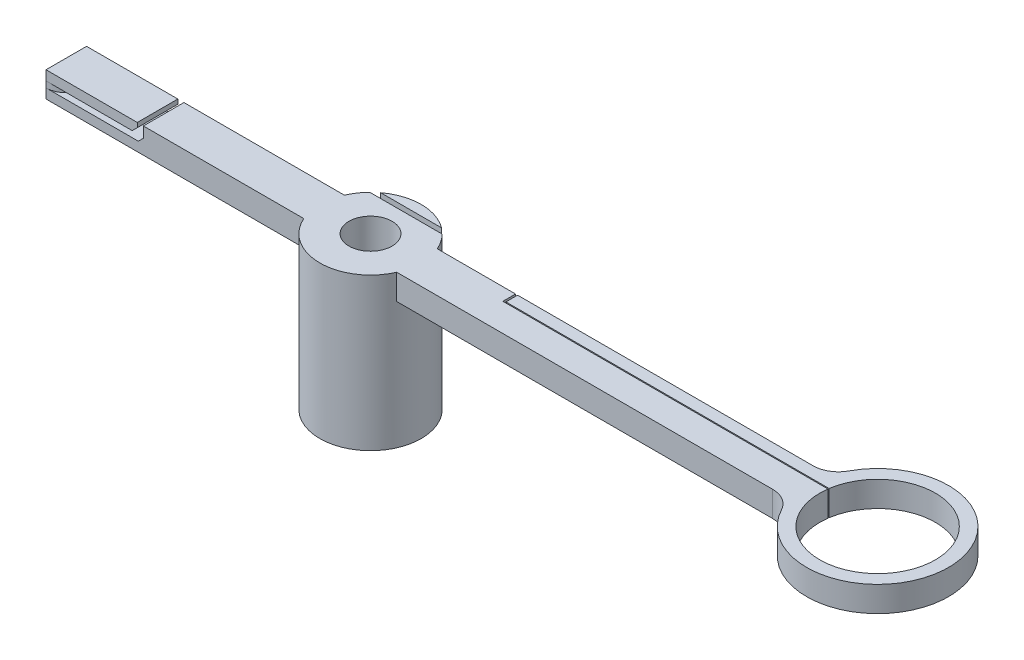
ISO-10303-21;
HEADER;
FILE_DESCRIPTION(('STEP AP214'),'2;1');
FILE_NAME('part.step','',(''),(''),'','','');
FILE_SCHEMA(('AUTOMOTIVE_DESIGN { 1 0 10303 214 1 1 1 1 }'));
ENDSEC;
DATA;
#1=APPLICATION_CONTEXT('core data for automotive mechanical design processes');
#2=APPLICATION_PROTOCOL_DEFINITION('international standard','automotive_design',2000,#1);
#3=PRODUCT_CONTEXT('',#1,'mechanical');
#4=PRODUCT('Part','Part','',(#3));
#5=PRODUCT_RELATED_PRODUCT_CATEGORY('part','',(#4));
#6=PRODUCT_DEFINITION_FORMATION('','',#4);
#7=PRODUCT_DEFINITION_CONTEXT('part definition',#1,'design');
#8=PRODUCT_DEFINITION('design','',#6,#7);
#9=PRODUCT_DEFINITION_SHAPE('','',#8);
#10=(LENGTH_UNIT() NAMED_UNIT(*) SI_UNIT(.MILLI.,.METRE.));
#11=(NAMED_UNIT(*) PLANE_ANGLE_UNIT() SI_UNIT($,.RADIAN.));
#12=(NAMED_UNIT(*) SI_UNIT($,.STERADIAN.) SOLID_ANGLE_UNIT());
#13=UNCERTAINTY_MEASURE_WITH_UNIT(LENGTH_MEASURE(1.E-05),#10,'distance_accuracy_value','');
#14=(GEOMETRIC_REPRESENTATION_CONTEXT(3) GLOBAL_UNCERTAINTY_ASSIGNED_CONTEXT((#13)) GLOBAL_UNIT_ASSIGNED_CONTEXT((#10,
#11,#12)) REPRESENTATION_CONTEXT('',''));
#15=CARTESIAN_POINT('',(0.,0.,0.));
#16=DIRECTION('',(0.,0.,1.));
#17=DIRECTION('',(1.,0.,0.));
#18=AXIS2_PLACEMENT_3D('',#15,#16,#17);
#19=CARTESIAN_POINT('',(0.,5.,0.));
#20=DIRECTION('',(0.,1.,0.));
#21=DIRECTION('',(0.,0.,1.));
#22=AXIS2_PLACEMENT_3D('',#19,#20,#21);
#23=PLANE('',#22);
#24=DIRECTION('',(-1.,0.,0.));
#25=VECTOR('',#24,1.);
#26=CARTESIAN_POINT('',(-107.141428428543,5.,-8.));
#27=LINE('',#26,#25);
#28=CARTESIAN_POINT('',(-94.,5.,-8.));
#29=VERTEX_POINT('',#28);
#30=CARTESIAN_POINT('',(-106.,5.,-8.));
#31=VERTEX_POINT('',#30);
#32=EDGE_CURVE('E261',#29,#31,#27,.T.);
#33=ORIENTED_EDGE('',*,*,#32,.F.);
#34=CARTESIAN_POINT('',(-100.,5.,0.));
#35=DIRECTION('',(0.,1.,0.));
#36=DIRECTION('',(0.,0.,1.));
#37=AXIS2_PLACEMENT_3D('',#34,#35,#36);
#38=CIRCLE('',#37,9.99999999999999);
#39=EDGE_CURVE('E490',#29,#31,#38,.T.);
#40=ORIENTED_EDGE('',*,*,#39,.T.);
#41=EDGE_LOOP('',(#33,#40));
#42=FACE_BOUND('',#41,.T.);
#43=ADVANCED_FACE('F31',(#42),#23,.T.);
#44=CARTESIAN_POINT('',(-100.,-25.,0.));
#45=DIRECTION('',(0.,1.,0.));
#46=DIRECTION('',(0.,0.,1.));
#47=AXIS2_PLACEMENT_3D('',#44,#45,#46);
#48=PLANE('',#47);
#49=CARTESIAN_POINT('',(-100.,-25.,0.));
#50=DIRECTION('',(0.,-1.,0.));
#51=DIRECTION('',(0.,0.,-1.));
#52=AXIS2_PLACEMENT_3D('',#49,#50,#51);
#53=CIRCLE('',#52,4.25000000000001);
#54=CARTESIAN_POINT('',(-100.,-25.,-4.25000000000001));
#55=VERTEX_POINT('',#54);
#56=EDGE_CURVE('E289',#55,#55,#53,.T.);
#57=ORIENTED_EDGE('',*,*,#56,.F.);
#58=EDGE_LOOP('',(#57));
#59=FACE_BOUND('',#58,.T.);
#60=CARTESIAN_POINT('',(-100.,-25.,0.));
#61=DIRECTION('',(0.,1.,0.));
#62=DIRECTION('',(0.,0.,1.));
#63=AXIS2_PLACEMENT_3D('',#60,#61,#62);
#64=CIRCLE('',#63,9.99999999999999);
#65=CARTESIAN_POINT('',(-107.141428428543,-25.,-7.));
#66=VERTEX_POINT('',#65);
#67=CARTESIAN_POINT('',(-92.8585715714572,-25.,-7.));
#68=VERTEX_POINT('',#67);
#69=EDGE_CURVE('E296',#66,#68,#64,.T.);
#70=ORIENTED_EDGE('',*,*,#69,.F.);
#71=DIRECTION('',(-1.,0.,0.));
#72=VECTOR('',#71,1.);
#73=CARTESIAN_POINT('',(-107.141428428543,-25.,-7.));
#74=LINE('',#73,#72);
#75=EDGE_CURVE('E269',#68,#66,#74,.T.);
#76=ORIENTED_EDGE('',*,*,#75,.F.);
#77=EDGE_LOOP('',(#70,#76));
#78=FACE_BOUND('',#77,.T.);
#79=ADVANCED_FACE('F620',(#59,#78),#48,.F.);
#80=CARTESIAN_POINT('',(-10.7819293264239,5.,4.00000000000003));
#81=DIRECTION('',(0.,0.,-1.));
#82=DIRECTION('',(-1.,0.,0.));
#83=AXIS2_PLACEMENT_3D('',#80,#81,#82);
#84=PLANE('',#83);
#85=DIRECTION('',(1.,0.,0.));
#86=VECTOR('',#85,1.);
#87=CARTESIAN_POINT('',(-10.7819293264239,0.,4.00000000000003));
#88=LINE('',#87,#86);
#89=CARTESIAN_POINT('',(-160.,0.,4.));
#90=VERTEX_POINT('',#89);
#91=CARTESIAN_POINT('',(-109.165151389912,0.,4.00000000000001));
#92=VERTEX_POINT('',#91);
#93=EDGE_CURVE('E414',#90,#92,#88,.T.);
#94=ORIENTED_EDGE('',*,*,#93,.T.);
#95=DIRECTION('',(0.,1.,0.));
#96=VECTOR('',#95,1.);
#97=CARTESIAN_POINT('',(-109.165151389912,-25.,4.00000000000001));
#98=LINE('',#97,#96);
#99=CARTESIAN_POINT('',(-109.165151389912,5.,4.00000000000001));
#100=VERTEX_POINT('',#99);
#101=EDGE_CURVE('E306',#92,#100,#98,.T.);
#102=ORIENTED_EDGE('',*,*,#101,.T.);
#103=DIRECTION('',(1.,0.,0.));
#104=VECTOR('',#103,1.);
#105=CARTESIAN_POINT('',(-10.7819293264239,5.,4.00000000000003));
#106=LINE('',#105,#104);
#107=CARTESIAN_POINT('',(-140.8,5.,4.00000000000004));
#108=VERTEX_POINT('',#107);
#109=EDGE_CURVE('E405',#108,#100,#106,.T.);
#110=ORIENTED_EDGE('',*,*,#109,.F.);
#111=DIRECTION('',(0.,1.,0.));
#112=VECTOR('',#111,1.);
#113=CARTESIAN_POINT('',(-140.8,2.9,4.00000000000004));
#114=LINE('',#113,#112);
#115=CARTESIAN_POINT('',(-140.8,2.9,4.00000000000004));
#116=VERTEX_POINT('',#115);
#117=EDGE_CURVE('E344',#116,#108,#114,.T.);
#118=ORIENTED_EDGE('',*,*,#117,.F.);
#119=DIRECTION('',(0.707106781186548,0.707106781186547,0.));
#120=VECTOR('',#119,1.);
#121=CARTESIAN_POINT('',(-141.8,1.9,4.00000000000004));
#122=LINE('',#121,#120);
#123=CARTESIAN_POINT('',(-141.8,1.9,4.00000000000004));
#124=VERTEX_POINT('',#123);
#125=EDGE_CURVE('E341',#124,#116,#122,.T.);
#126=ORIENTED_EDGE('',*,*,#125,.F.);
#127=DIRECTION('',(1.,0.,0.));
#128=VECTOR('',#127,1.);
#129=CARTESIAN_POINT('',(-156.,1.9,4.00000000000004));
#130=LINE('',#129,#128);
#131=CARTESIAN_POINT('',(-160.,1.9,4.));
#132=VERTEX_POINT('',#131);
#133=EDGE_CURVE('E338',#132,#124,#130,.T.);
#134=ORIENTED_EDGE('',*,*,#133,.F.);
#135=DIRECTION('',(0.,-1.,0.));
#136=VECTOR('',#135,1.);
#137=CARTESIAN_POINT('',(-160.,5.,4.));
#138=LINE('',#137,#136);
#139=EDGE_CURVE('E404',#132,#90,#138,.T.);
#140=ORIENTED_EDGE('',*,*,#139,.T.);
#141=EDGE_LOOP('',(#94,#102,#110,#118,#126,#134,#140));
#142=FACE_BOUND('',#141,.T.);
#143=ADVANCED_FACE('F548',(#142),#84,.F.);
#144=CARTESIAN_POINT('',(-10.7819293264239,5.,-4.00000000000002));
#145=DIRECTION('',(0.,0.,1.));
#146=DIRECTION('',(1.,0.,0.));
#147=AXIS2_PLACEMENT_3D('',#144,#145,#146);
#148=PLANE('',#147);
#149=DIRECTION('',(-1.,0.,0.));
#150=VECTOR('',#149,1.);
#151=CARTESIAN_POINT('',(-10.7819293264239,0.,-4.00000000000002));
#152=LINE('',#151,#150);
#153=CARTESIAN_POINT('',(-75.4,0.,-4.00000000000001));
#154=VERTEX_POINT('',#153);
#155=CARTESIAN_POINT('',(-90.8348486100883,0.,-4.00000000000001));
#156=VERTEX_POINT('',#155);
#157=EDGE_CURVE('E410',#154,#156,#152,.T.);
#158=ORIENTED_EDGE('',*,*,#157,.T.);
#159=DIRECTION('',(0.,1.,0.));
#160=VECTOR('',#159,1.);
#161=CARTESIAN_POINT('',(-90.8348486100883,-25.,-4.00000000000001));
#162=LINE('',#161,#160);
#163=CARTESIAN_POINT('',(-90.8348486100883,5.,-4.00000000000001));
#164=VERTEX_POINT('',#163);
#165=EDGE_CURVE('E309',#156,#164,#162,.T.);
#166=ORIENTED_EDGE('',*,*,#165,.T.);
#167=DIRECTION('',(-1.,0.,0.));
#168=VECTOR('',#167,1.);
#169=CARTESIAN_POINT('',(-10.7819293264239,5.,-4.00000000000002));
#170=LINE('',#169,#168);
#171=CARTESIAN_POINT('',(-75.4,5.,-4.00000000000002));
#172=VERTEX_POINT('',#171);
#173=EDGE_CURVE('E397',#172,#164,#170,.T.);
#174=ORIENTED_EDGE('',*,*,#173,.F.);
#175=DIRECTION('',(0.,-1.,0.));
#176=VECTOR('',#175,1.);
#177=CARTESIAN_POINT('',(-75.4,5.,-4.00000000000002));
#178=LINE('',#177,#176);
#179=EDGE_CURVE('E383',#172,#154,#178,.T.);
#180=ORIENTED_EDGE('',*,*,#179,.T.);
#181=EDGE_LOOP('',(#158,#166,#174,#180));
#182=FACE_BOUND('',#181,.T.);
#183=ADVANCED_FACE('F612',(#182),#148,.F.);
#184=CARTESIAN_POINT('',(0.,0.,0.));
#185=DIRECTION('',(0.,1.,0.));
#186=DIRECTION('',(0.,0.,1.));
#187=AXIS2_PLACEMENT_3D('',#184,#185,#186);
#188=PLANE('',#187);
#189=CARTESIAN_POINT('',(-90.8348486100883,0.,4.00000000000002));
#190=VERTEX_POINT('',#189);
#191=CARTESIAN_POINT('',(-16.7332005306815,0.,4.00000000000003));
#192=VERTEX_POINT('',#191);
#193=EDGE_CURVE('E413',#190,#192,#88,.T.);
#194=ORIENTED_EDGE('',*,*,#193,.F.);
#195=CARTESIAN_POINT('',(-100.,0.,0.));
#196=DIRECTION('',(0.,1.,0.));
#197=DIRECTION('',(0.,0.,1.));
#198=AXIS2_PLACEMENT_3D('',#195,#196,#197);
#199=CIRCLE('',#198,9.99999999999999);
#200=EDGE_CURVE('E477',#190,#156,#199,.T.);
#201=ORIENTED_EDGE('',*,*,#200,.T.);
#202=ORIENTED_EDGE('',*,*,#157,.F.);
#203=DIRECTION('',(0.,0.,-1.));
#204=VECTOR('',#203,1.);
#205=CARTESIAN_POINT('',(-75.4,0.,-4.00000000000002));
#206=LINE('',#205,#204);
#207=CARTESIAN_POINT('',(-75.4,0.,-1.5));
#208=VERTEX_POINT('',#207);
#209=EDGE_CURVE('E366',#208,#154,#206,.T.);
#210=ORIENTED_EDGE('',*,*,#209,.F.);
#211=DIRECTION('',(-1.,0.,0.));
#212=VECTOR('',#211,1.);
#213=CARTESIAN_POINT('',(-75.4,0.,-1.5));
#214=LINE('',#213,#212);
#215=CARTESIAN_POINT('',(-11.3008849211024,0.,-1.5));
#216=VERTEX_POINT('',#215);
#217=EDGE_CURVE('E380',#216,#208,#214,.T.);
#218=ORIENTED_EDGE('',*,*,#217,.F.);
#219=CARTESIAN_POINT('',(0.,0.,0.));
#220=DIRECTION('',(0.,1.,0.));
#221=DIRECTION('',(0.,0.,1.));
#222=AXIS2_PLACEMENT_3D('',#219,#220,#221);
#223=CIRCLE('',#222,11.4);
#224=CARTESIAN_POINT('',(-11.2725329895281,0.,-1.7));
#225=VERTEX_POINT('',#224);
#226=EDGE_CURVE('E426',#216,#225,#223,.T.);
#227=ORIENTED_EDGE('',*,*,#226,.T.);
#228=DIRECTION('',(1.,0.,0.));
#229=VECTOR('',#228,1.);
#230=CARTESIAN_POINT('',(0.,0.,-1.7));
#231=LINE('',#230,#229);
#232=CARTESIAN_POINT('',(-75.,0.,-1.70000000000001));
#233=VERTEX_POINT('',#232);
#234=EDGE_CURVE('E378',#233,#225,#231,.T.);
#235=ORIENTED_EDGE('',*,*,#234,.F.);
#236=DIRECTION('',(0.,0.,1.));
#237=VECTOR('',#236,1.);
#238=CARTESIAN_POINT('',(-75.,0.,-1.70000000000001));
#239=LINE('',#238,#237);
#240=CARTESIAN_POINT('',(-75.,0.,-4.00000000000002));
#241=VERTEX_POINT('',#240);
#242=EDGE_CURVE('E361',#241,#233,#239,.T.);
#243=ORIENTED_EDGE('',*,*,#242,.F.);
#244=CARTESIAN_POINT('',(-16.7332005306815,0.,-4.00000000000002));
#245=VERTEX_POINT('',#244);
#246=EDGE_CURVE('E406',#245,#241,#152,.T.);
#247=ORIENTED_EDGE('',*,*,#246,.F.);
#248=CARTESIAN_POINT('',(-16.7332005306815,0.,-9.00000000000002));
#249=DIRECTION('',(0.,1.,0.));
#250=DIRECTION('',(0.,0.,1.));
#251=AXIS2_PLACEMENT_3D('',#248,#249,#250);
#252=CIRCLE('',#251,5.);
#253=CARTESIAN_POINT('',(-12.3297267068179,0.,-6.63157894736844));
#254=VERTEX_POINT('',#253);
#255=EDGE_CURVE('E454',#245,#254,#252,.T.);
#256=ORIENTED_EDGE('',*,*,#255,.T.);
#257=CARTESIAN_POINT('',(0.,0.,0.));
#258=DIRECTION('',(0.,1.,0.));
#259=DIRECTION('',(0.,0.,1.));
#260=AXIS2_PLACEMENT_3D('',#257,#258,#259);
#261=CIRCLE('',#260,14.);
#262=CARTESIAN_POINT('',(-12.3297267068179,0.,6.63157894736844));
#263=VERTEX_POINT('',#262);
#264=EDGE_CURVE('E431',#263,#254,#261,.T.);
#265=ORIENTED_EDGE('',*,*,#264,.F.);
#266=CARTESIAN_POINT('',(-16.7332005306815,0.,9.00000000000003));
#267=DIRECTION('',(0.,1.,0.));
#268=DIRECTION('',(0.,0.,1.));
#269=AXIS2_PLACEMENT_3D('',#266,#267,#268);
#270=CIRCLE('',#269,5.);
#271=EDGE_CURVE('E451',#263,#192,#270,.T.);
#272=ORIENTED_EDGE('',*,*,#271,.T.);
#273=EDGE_LOOP('',(#194,#201,#202,#210,#218,#227,#235,#243,#247,#256,#265,#272));
#274=FACE_BOUND('',#273,.T.);
#275=ADVANCED_FACE('F575',(#274),#188,.F.);
#276=CARTESIAN_POINT('',(-90.8348486100883,5.,4.00000000000002));
#277=VERTEX_POINT('',#276);
#278=CARTESIAN_POINT('',(-16.7332005306815,5.,4.00000000000003));
#279=VERTEX_POINT('',#278);
#280=EDGE_CURVE('E400',#277,#279,#106,.T.);
#281=ORIENTED_EDGE('',*,*,#280,.F.);
#282=DIRECTION('',(0.,1.,0.));
#283=VECTOR('',#282,1.);
#284=CARTESIAN_POINT('',(-90.8348486100883,-25.,4.00000000000002));
#285=LINE('',#284,#283);
#286=EDGE_CURVE('E312',#277,#190,#285,.F.);
#287=ORIENTED_EDGE('',*,*,#286,.T.);
#288=ORIENTED_EDGE('',*,*,#193,.T.);
#289=DIRECTION('',(0.,1.,0.));
#290=VECTOR('',#289,1.);
#291=CARTESIAN_POINT('',(-16.7332005306815,5.,4.00000000000003));
#292=LINE('',#291,#290);
#293=EDGE_CURVE('E437',#192,#279,#292,.T.);
#294=ORIENTED_EDGE('',*,*,#293,.T.);
#295=EDGE_LOOP('',(#281,#287,#288,#294));
#296=FACE_BOUND('',#295,.T.);
#297=ADVANCED_FACE('F570',(#296),#84,.F.);
#298=DIRECTION('',(1.,0.,0.));
#299=VECTOR('',#298,1.);
#300=CARTESIAN_POINT('',(-143.,3.1,-4.));
#301=LINE('',#300,#299);
#302=CARTESIAN_POINT('',(-160.,3.1,-4.));
#303=VERTEX_POINT('',#302);
#304=CARTESIAN_POINT('',(-143.,3.1,-4.));
#305=VERTEX_POINT('',#304);
#306=EDGE_CURVE('E319',#303,#305,#301,.T.);
#307=ORIENTED_EDGE('',*,*,#306,.F.);
#308=DIRECTION('',(0.,-1.,0.));
#309=VECTOR('',#308,1.);
#310=CARTESIAN_POINT('',(-160.,5.,-4.));
#311=LINE('',#310,#309);
#312=CARTESIAN_POINT('',(-160.,5.,-4.));
#313=VERTEX_POINT('',#312);
#314=EDGE_CURVE('E423',#313,#303,#311,.T.);
#315=ORIENTED_EDGE('',*,*,#314,.F.);
#316=CARTESIAN_POINT('',(-142.,5.,-4.));
#317=VERTEX_POINT('',#316);
#318=EDGE_CURVE('E417',#317,#313,#170,.T.);
#319=ORIENTED_EDGE('',*,*,#318,.F.);
#320=DIRECTION('',(0.,1.,0.));
#321=VECTOR('',#320,1.);
#322=CARTESIAN_POINT('',(-142.,5.,-4.));
#323=LINE('',#322,#321);
#324=CARTESIAN_POINT('',(-142.,4.1,-4.));
#325=VERTEX_POINT('',#324);
#326=EDGE_CURVE('E350',#325,#317,#323,.T.);
#327=ORIENTED_EDGE('',*,*,#326,.F.);
#328=DIRECTION('',(0.707106781186546,0.707106781186549,0.));
#329=VECTOR('',#328,1.);
#330=CARTESIAN_POINT('',(-142.,4.1,-4.));
#331=LINE('',#330,#329);
#332=EDGE_CURVE('E316',#305,#325,#331,.T.);
#333=ORIENTED_EDGE('',*,*,#332,.F.);
#334=EDGE_LOOP('',(#307,#315,#319,#327,#333));
#335=FACE_BOUND('',#334,.T.);
#336=ADVANCED_FACE('F513',(#335),#148,.F.);
#337=DIRECTION('',(1.,0.,0.));
#338=VECTOR('',#337,1.);
#339=CARTESIAN_POINT('',(-107.141428428543,5.,-7.));
#340=LINE('',#339,#338);
#341=CARTESIAN_POINT('',(-107.141428428543,5.,-7.));
#342=VERTEX_POINT('',#341);
#343=CARTESIAN_POINT('',(-92.8585715714572,5.,-7.));
#344=VERTEX_POINT('',#343);
#345=EDGE_CURVE('E491',#342,#344,#340,.T.);
#346=ORIENTED_EDGE('',*,*,#345,.F.);
#347=CARTESIAN_POINT('',(-109.165151389912,5.,-4.00000000000001));
#348=VERTEX_POINT('',#347);
#349=EDGE_CURVE('E267',#342,#348,#38,.T.);
#350=ORIENTED_EDGE('',*,*,#349,.T.);
#351=CARTESIAN_POINT('',(-140.8,5.,-4.00000000000001));
#352=VERTEX_POINT('',#351);
#353=EDGE_CURVE('E398',#348,#352,#170,.T.);
#354=ORIENTED_EDGE('',*,*,#353,.T.);
#355=DIRECTION('',(0.,0.,1.));
#356=VECTOR('',#355,1.);
#357=CARTESIAN_POINT('',(-140.8,5.,-14.001));
#358=LINE('',#357,#356);
#359=EDGE_CURVE('E347',#352,#108,#358,.T.);
#360=ORIENTED_EDGE('',*,*,#359,.T.);
#361=ORIENTED_EDGE('',*,*,#109,.T.);
#362=EDGE_CURVE('E293',#100,#277,#38,.T.);
#363=ORIENTED_EDGE('',*,*,#362,.T.);
#364=ORIENTED_EDGE('',*,*,#280,.T.);
#365=CARTESIAN_POINT('',(-16.7332005306815,5.,9.00000000000003));
#366=DIRECTION('',(0.,1.,0.));
#367=DIRECTION('',(0.,0.,1.));
#368=AXIS2_PLACEMENT_3D('',#365,#366,#367);
#369=CIRCLE('',#368,5.);
#370=CARTESIAN_POINT('',(-12.3297267068179,5.,6.63157894736844));
#371=VERTEX_POINT('',#370);
#372=EDGE_CURVE('E449',#279,#371,#369,.F.);
#373=ORIENTED_EDGE('',*,*,#372,.T.);
#374=CARTESIAN_POINT('',(0.,5.,0.));
#375=DIRECTION('',(0.,1.,0.));
#376=DIRECTION('',(0.,0.,1.));
#377=AXIS2_PLACEMENT_3D('',#374,#375,#376);
#378=CIRCLE('',#377,14.);
#379=CARTESIAN_POINT('',(-12.3297267068179,5.,-6.63157894736844));
#380=VERTEX_POINT('',#379);
#381=EDGE_CURVE('E434',#371,#380,#378,.T.);
#382=ORIENTED_EDGE('',*,*,#381,.T.);
#383=CARTESIAN_POINT('',(-16.7332005306815,5.,-9.00000000000002));
#384=DIRECTION('',(0.,1.,0.));
#385=DIRECTION('',(0.,0.,1.));
#386=AXIS2_PLACEMENT_3D('',#383,#384,#385);
#387=CIRCLE('',#386,5.);
#388=CARTESIAN_POINT('',(-16.7332005306815,5.,-4.00000000000002));
#389=VERTEX_POINT('',#388);
#390=EDGE_CURVE('E456',#380,#389,#387,.F.);
#391=ORIENTED_EDGE('',*,*,#390,.T.);
#392=CARTESIAN_POINT('',(-75.,5.,-4.00000000000001));
#393=VERTEX_POINT('',#392);
#394=EDGE_CURVE('E393',#389,#393,#170,.T.);
#395=ORIENTED_EDGE('',*,*,#394,.T.);
#396=DIRECTION('',(0.,0.,1.));
#397=VECTOR('',#396,1.);
#398=CARTESIAN_POINT('',(-75.,5.,-1.70000000000001));
#399=LINE('',#398,#397);
#400=CARTESIAN_POINT('',(-75.,5.,-1.70000000000001));
#401=VERTEX_POINT('',#400);
#402=EDGE_CURVE('E362',#393,#401,#399,.T.);
#403=ORIENTED_EDGE('',*,*,#402,.T.);
#404=DIRECTION('',(1.,0.,0.));
#405=VECTOR('',#404,1.);
#406=CARTESIAN_POINT('',(0.,5.,-1.7));
#407=LINE('',#406,#405);
#408=CARTESIAN_POINT('',(-11.2725329895281,5.,-1.7));
#409=VERTEX_POINT('',#408);
#410=EDGE_CURVE('E365',#401,#409,#407,.T.);
#411=ORIENTED_EDGE('',*,*,#410,.T.);
#412=CARTESIAN_POINT('',(0.,5.,0.));
#413=DIRECTION('',(0.,1.,0.));
#414=DIRECTION('',(0.,0.,1.));
#415=AXIS2_PLACEMENT_3D('',#412,#413,#414);
#416=CIRCLE('',#415,11.4);
#417=CARTESIAN_POINT('',(-11.3008849211024,5.,-1.5));
#418=VERTEX_POINT('',#417);
#419=EDGE_CURVE('E428',#418,#409,#416,.T.);
#420=ORIENTED_EDGE('',*,*,#419,.F.);
#421=DIRECTION('',(-1.,0.,0.));
#422=VECTOR('',#421,1.);
#423=CARTESIAN_POINT('',(-75.4,5.,-1.5));
#424=LINE('',#423,#422);
#425=CARTESIAN_POINT('',(-75.4,5.,-1.5));
#426=VERTEX_POINT('',#425);
#427=EDGE_CURVE('E369',#418,#426,#424,.T.);
#428=ORIENTED_EDGE('',*,*,#427,.T.);
#429=DIRECTION('',(0.,0.,-1.));
#430=VECTOR('',#429,1.);
#431=CARTESIAN_POINT('',(-75.4,5.,-4.00000000000002));
#432=LINE('',#431,#430);
#433=EDGE_CURVE('E372',#426,#172,#432,.T.);
#434=ORIENTED_EDGE('',*,*,#433,.T.);
#435=ORIENTED_EDGE('',*,*,#173,.T.);
#436=EDGE_CURVE('E300',#164,#344,#38,.T.);
#437=ORIENTED_EDGE('',*,*,#436,.T.);
#438=EDGE_LOOP('',(#346,#350,#354,#360,#361,#363,#364,#373,#382,#391,#395,#403,#411,#420,#428,
#434,#435,#437));
#439=FACE_BOUND('',#438,.T.);
#440=CARTESIAN_POINT('',(-100.,5.,0.));
#441=DIRECTION('',(0.,-1.,0.));
#442=DIRECTION('',(0.,0.,-1.));
#443=AXIS2_PLACEMENT_3D('',#440,#441,#442);
#444=CIRCLE('',#443,4.25000000000001);
#445=CARTESIAN_POINT('',(-100.,5.,-4.25000000000001));
#446=VERTEX_POINT('',#445);
#447=EDGE_CURVE('E290',#446,#446,#444,.T.);
#448=ORIENTED_EDGE('',*,*,#447,.T.);
#449=EDGE_LOOP('',(#448));
#450=FACE_BOUND('',#449,.T.);
#451=ADVANCED_FACE('F494',(#439,#450),#23,.T.);
#452=ORIENTED_EDGE('',*,*,#353,.F.);
#453=DIRECTION('',(0.,1.,0.));
#454=VECTOR('',#453,1.);
#455=CARTESIAN_POINT('',(-109.165151389912,-25.,-4.00000000000001));
#456=LINE('',#455,#454);
#457=CARTESIAN_POINT('',(-109.165151389912,0.,-4.00000000000001));
#458=VERTEX_POINT('',#457);
#459=EDGE_CURVE('E303',#348,#458,#456,.F.);
#460=ORIENTED_EDGE('',*,*,#459,.T.);
#461=CARTESIAN_POINT('',(-160.,0.,-4.));
#462=VERTEX_POINT('',#461);
#463=EDGE_CURVE('E386',#458,#462,#152,.T.);
#464=ORIENTED_EDGE('',*,*,#463,.T.);
#465=CARTESIAN_POINT('',(-160.,1.9,-4.));
#466=VERTEX_POINT('',#465);
#467=EDGE_CURVE('E421',#466,#462,#311,.T.);
#468=ORIENTED_EDGE('',*,*,#467,.F.);
#469=DIRECTION('',(-1.,0.,0.));
#470=VECTOR('',#469,1.);
#471=CARTESIAN_POINT('',(-156.,1.9,-4.));
#472=LINE('',#471,#470);
#473=CARTESIAN_POINT('',(-141.8,1.9,-4.));
#474=VERTEX_POINT('',#473);
#475=EDGE_CURVE('E322',#474,#466,#472,.T.);
#476=ORIENTED_EDGE('',*,*,#475,.F.);
#477=DIRECTION('',(-0.707106781186548,-0.707106781186547,0.));
#478=VECTOR('',#477,1.);
#479=CARTESIAN_POINT('',(-141.8,1.9,-4.));
#480=LINE('',#479,#478);
#481=CARTESIAN_POINT('',(-140.8,2.9,-4.));
#482=VERTEX_POINT('',#481);
#483=EDGE_CURVE('E324',#482,#474,#480,.T.);
#484=ORIENTED_EDGE('',*,*,#483,.F.);
#485=DIRECTION('',(0.,-1.,0.));
#486=VECTOR('',#485,1.);
#487=CARTESIAN_POINT('',(-140.8,2.9,-4.));
#488=LINE('',#487,#486);
#489=EDGE_CURVE('E327',#352,#482,#488,.T.);
#490=ORIENTED_EDGE('',*,*,#489,.F.);
#491=EDGE_LOOP('',(#452,#460,#464,#468,#476,#484,#490));
#492=FACE_BOUND('',#491,.T.);
#493=ADVANCED_FACE('F501',(#492),#148,.F.);
#494=CARTESIAN_POINT('',(0.,5.,0.));
#495=DIRECTION('',(0.,-1.,0.));
#496=DIRECTION('',(0.,0.,-1.));
#497=AXIS2_PLACEMENT_3D('',#494,#495,#496);
#498=CYLINDRICAL_SURFACE('',#497,14.);
#499=ORIENTED_EDGE('',*,*,#381,.F.);
#500=DIRECTION('',(0.,-1.,0.));
#501=VECTOR('',#500,1.);
#502=CARTESIAN_POINT('',(-12.3297267068179,5.,6.63157894736844));
#503=LINE('',#502,#501);
#504=EDGE_CURVE('E444',#371,#263,#503,.T.);
#505=ORIENTED_EDGE('',*,*,#504,.T.);
#506=ORIENTED_EDGE('',*,*,#264,.T.);
#507=DIRECTION('',(0.,-1.,0.));
#508=VECTOR('',#507,1.);
#509=CARTESIAN_POINT('',(-12.3297267068179,5.,-6.63157894736844));
#510=LINE('',#509,#508);
#511=EDGE_CURVE('E442',#254,#380,#510,.F.);
#512=ORIENTED_EDGE('',*,*,#511,.T.);
#513=EDGE_LOOP('',(#499,#505,#506,#512));
#514=FACE_BOUND('',#513,.T.);
#515=ADVANCED_FACE('F579',(#514),#498,.T.);
#516=DIRECTION('',(0.,0.,1.));
#517=VECTOR('',#516,1.);
#518=CARTESIAN_POINT('',(-142.,5.,-14.001));
#519=LINE('',#518,#517);
#520=CARTESIAN_POINT('',(-142.,5.,4.));
#521=VERTEX_POINT('',#520);
#522=EDGE_CURVE('E346',#317,#521,#519,.T.);
#523=ORIENTED_EDGE('',*,*,#522,.F.);
#524=ORIENTED_EDGE('',*,*,#318,.T.);
#525=DIRECTION('',(0.,0.,1.));
#526=VECTOR('',#525,1.);
#527=CARTESIAN_POINT('',(-160.,5.,-4.));
#528=LINE('',#527,#526);
#529=CARTESIAN_POINT('',(-160.,5.,4.));
#530=VERTEX_POINT('',#529);
#531=EDGE_CURVE('E396',#313,#530,#528,.T.);
#532=ORIENTED_EDGE('',*,*,#531,.T.);
#533=EDGE_CURVE('E401',#530,#521,#106,.T.);
#534=ORIENTED_EDGE('',*,*,#533,.T.);
#535=EDGE_LOOP('',(#523,#524,#532,#534));
#536=FACE_BOUND('',#535,.T.);
#537=ADVANCED_FACE('F508',(#536),#23,.T.);
#538=ORIENTED_EDGE('',*,*,#463,.F.);
#539=EDGE_CURVE('E472',#458,#92,#199,.T.);
#540=ORIENTED_EDGE('',*,*,#539,.T.);
#541=ORIENTED_EDGE('',*,*,#93,.F.);
#542=DIRECTION('',(0.,0.,1.));
#543=VECTOR('',#542,1.);
#544=CARTESIAN_POINT('',(-160.,0.,-4.));
#545=LINE('',#544,#543);
#546=EDGE_CURVE('E409',#462,#90,#545,.T.);
#547=ORIENTED_EDGE('',*,*,#546,.F.);
#548=EDGE_LOOP('',(#538,#540,#541,#547));
#549=FACE_BOUND('',#548,.T.);
#550=ADVANCED_FACE('F546',(#549),#188,.F.);
#551=CARTESIAN_POINT('',(0.,5.,0.));
#552=DIRECTION('',(0.,-1.,0.));
#553=DIRECTION('',(0.,0.,-1.));
#554=AXIS2_PLACEMENT_3D('',#551,#552,#553);
#555=CYLINDRICAL_SURFACE('',#554,11.4);
#556=DIRECTION('',(0.,-1.,0.));
#557=VECTOR('',#556,1.);
#558=CARTESIAN_POINT('',(-11.3008849211024,5.,-1.5));
#559=LINE('',#558,#557);
#560=EDGE_CURVE('E460',#418,#216,#559,.T.);
#561=ORIENTED_EDGE('',*,*,#560,.F.);
#562=ORIENTED_EDGE('',*,*,#419,.T.);
#563=DIRECTION('',(0.,-1.,0.));
#564=VECTOR('',#563,1.);
#565=CARTESIAN_POINT('',(-11.2725329895281,5.,-1.7));
#566=LINE('',#565,#564);
#567=EDGE_CURVE('E458',#225,#409,#566,.F.);
#568=ORIENTED_EDGE('',*,*,#567,.F.);
#569=ORIENTED_EDGE('',*,*,#226,.F.);
#570=EDGE_LOOP('',(#561,#562,#568,#569));
#571=FACE_BOUND('',#570,.T.);
#572=ADVANCED_FACE('F600',(#571),#555,.F.);
#573=ORIENTED_EDGE('',*,*,#246,.T.);
#574=DIRECTION('',(0.,-1.,0.));
#575=VECTOR('',#574,1.);
#576=CARTESIAN_POINT('',(-75.,5.,-4.00000000000002));
#577=LINE('',#576,#575);
#578=EDGE_CURVE('E375',#393,#241,#577,.T.);
#579=ORIENTED_EDGE('',*,*,#578,.F.);
#580=ORIENTED_EDGE('',*,*,#394,.F.);
#581=DIRECTION('',(0.,1.,0.));
#582=VECTOR('',#581,1.);
#583=CARTESIAN_POINT('',(-16.7332005306815,0.,-4.00000000000002));
#584=LINE('',#583,#582);
#585=EDGE_CURVE('E446',#389,#245,#584,.F.);
#586=ORIENTED_EDGE('',*,*,#585,.T.);
#587=EDGE_LOOP('',(#573,#579,#580,#586));
#588=FACE_BOUND('',#587,.T.);
#589=ADVANCED_FACE('F587',(#588),#148,.F.);
#590=CARTESIAN_POINT('',(-160.,3.1,4.));
#591=VERTEX_POINT('',#590);
#592=EDGE_CURVE('E418',#530,#591,#138,.T.);
#593=ORIENTED_EDGE('',*,*,#592,.T.);
#594=DIRECTION('',(-1.,0.,0.));
#595=VECTOR('',#594,1.);
#596=CARTESIAN_POINT('',(-143.,3.1,4.00000000000004));
#597=LINE('',#596,#595);
#598=CARTESIAN_POINT('',(-143.,3.1,4.00000000000004));
#599=VERTEX_POINT('',#598);
#600=EDGE_CURVE('E336',#599,#591,#597,.T.);
#601=ORIENTED_EDGE('',*,*,#600,.F.);
#602=DIRECTION('',(-0.707106781186546,-0.707106781186549,0.));
#603=VECTOR('',#602,1.);
#604=CARTESIAN_POINT('',(-142.,4.1,4.00000000000004));
#605=LINE('',#604,#603);
#606=CARTESIAN_POINT('',(-142.,4.1,4.00000000000004));
#607=VERTEX_POINT('',#606);
#608=EDGE_CURVE('E333',#607,#599,#605,.T.);
#609=ORIENTED_EDGE('',*,*,#608,.F.);
#610=DIRECTION('',(0.,-1.,0.));
#611=VECTOR('',#610,1.);
#612=CARTESIAN_POINT('',(-142.,5.,4.00000000000004));
#613=LINE('',#612,#611);
#614=EDGE_CURVE('E330',#521,#607,#613,.T.);
#615=ORIENTED_EDGE('',*,*,#614,.F.);
#616=ORIENTED_EDGE('',*,*,#533,.F.);
#617=EDGE_LOOP('',(#593,#601,#609,#615,#616));
#618=FACE_BOUND('',#617,.T.);
#619=ADVANCED_FACE('F527',(#618),#84,.F.);
#620=CARTESIAN_POINT('',(-160.,5.,-4.));
#621=DIRECTION('',(1.,0.,0.));
#622=DIRECTION('',(0.,0.,-1.));
#623=AXIS2_PLACEMENT_3D('',#620,#621,#622);
#624=PLANE('',#623);
#625=ORIENTED_EDGE('',*,*,#546,.T.);
#626=ORIENTED_EDGE('',*,*,#139,.F.);
#627=EDGE_CURVE('E422',#591,#132,#138,.T.);
#628=ORIENTED_EDGE('',*,*,#627,.F.);
#629=ORIENTED_EDGE('',*,*,#592,.F.);
#630=ORIENTED_EDGE('',*,*,#531,.F.);
#631=ORIENTED_EDGE('',*,*,#314,.T.);
#632=EDGE_CURVE('E427',#303,#466,#311,.T.);
#633=ORIENTED_EDGE('',*,*,#632,.T.);
#634=ORIENTED_EDGE('',*,*,#467,.T.);
#635=EDGE_LOOP('',(#625,#626,#628,#629,#630,#631,#633,#634));
#636=FACE_BOUND('',#635,.T.);
#637=ADVANCED_FACE('F518',(#636),#624,.F.);
#638=CARTESIAN_POINT('',(-16.7332005306815,5.,9.00000000000003));
#639=DIRECTION('',(0.,-1.,0.));
#640=DIRECTION('',(0.,0.,-1.));
#641=AXIS2_PLACEMENT_3D('',#638,#639,#640);
#642=CYLINDRICAL_SURFACE('',#641,5.);
#643=ORIENTED_EDGE('',*,*,#271,.F.);
#644=ORIENTED_EDGE('',*,*,#504,.F.);
#645=ORIENTED_EDGE('',*,*,#372,.F.);
#646=ORIENTED_EDGE('',*,*,#293,.F.);
#647=EDGE_LOOP('',(#643,#644,#645,#646));
#648=FACE_BOUND('',#647,.T.);
#649=ADVANCED_FACE('F569',(#648),#642,.F.);
#650=CARTESIAN_POINT('',(-16.7332005306815,5.,-9.00000000000002));
#651=DIRECTION('',(0.,-1.,0.));
#652=DIRECTION('',(0.,0.,-1.));
#653=AXIS2_PLACEMENT_3D('',#650,#651,#652);
#654=CYLINDRICAL_SURFACE('',#653,5.);
#655=ORIENTED_EDGE('',*,*,#390,.F.);
#656=ORIENTED_EDGE('',*,*,#511,.F.);
#657=ORIENTED_EDGE('',*,*,#255,.F.);
#658=ORIENTED_EDGE('',*,*,#585,.F.);
#659=EDGE_LOOP('',(#655,#656,#657,#658));
#660=FACE_BOUND('',#659,.T.);
#661=ADVANCED_FACE('F582',(#660),#654,.F.);
#662=CARTESIAN_POINT('',(-75.,5.,-1.70000000000001));
#663=DIRECTION('',(1.,0.,0.));
#664=DIRECTION('',(0.,0.,-1.));
#665=AXIS2_PLACEMENT_3D('',#662,#663,#664);
#666=PLANE('',#665);
#667=ORIENTED_EDGE('',*,*,#242,.T.);
#668=DIRECTION('',(0.,-1.,0.));
#669=VECTOR('',#668,1.);
#670=CARTESIAN_POINT('',(-75.,5.,-1.70000000000001));
#671=LINE('',#670,#669);
#672=EDGE_CURVE('E390',#401,#233,#671,.T.);
#673=ORIENTED_EDGE('',*,*,#672,.F.);
#674=ORIENTED_EDGE('',*,*,#402,.F.);
#675=ORIENTED_EDGE('',*,*,#578,.T.);
#676=EDGE_LOOP('',(#667,#673,#674,#675));
#677=FACE_BOUND('',#676,.T.);
#678=ADVANCED_FACE('F590',(#677),#666,.F.);
#679=CARTESIAN_POINT('',(0.,5.,-1.7));
#680=DIRECTION('',(0.,0.,-1.));
#681=DIRECTION('',(-1.,0.,0.));
#682=AXIS2_PLACEMENT_3D('',#679,#680,#681);
#683=PLANE('',#682);
#684=ORIENTED_EDGE('',*,*,#567,.T.);
#685=ORIENTED_EDGE('',*,*,#410,.F.);
#686=ORIENTED_EDGE('',*,*,#672,.T.);
#687=ORIENTED_EDGE('',*,*,#234,.T.);
#688=EDGE_LOOP('',(#684,#685,#686,#687));
#689=FACE_BOUND('',#688,.T.);
#690=ADVANCED_FACE('F596',(#689),#683,.F.);
#691=CARTESIAN_POINT('',(-75.4,5.,-4.00000000000002));
#692=DIRECTION('',(-1.,0.,0.));
#693=DIRECTION('',(0.,0.,1.));
#694=AXIS2_PLACEMENT_3D('',#691,#692,#693);
#695=PLANE('',#694);
#696=ORIENTED_EDGE('',*,*,#209,.T.);
#697=ORIENTED_EDGE('',*,*,#179,.F.);
#698=ORIENTED_EDGE('',*,*,#433,.F.);
#699=DIRECTION('',(0.,-1.,0.));
#700=VECTOR('',#699,1.);
#701=CARTESIAN_POINT('',(-75.4,5.,-1.5));
#702=LINE('',#701,#700);
#703=EDGE_CURVE('E387',#426,#208,#702,.T.);
#704=ORIENTED_EDGE('',*,*,#703,.T.);
#705=EDGE_LOOP('',(#696,#697,#698,#704));
#706=FACE_BOUND('',#705,.T.);
#707=ADVANCED_FACE('F608',(#706),#695,.F.);
#708=CARTESIAN_POINT('',(-75.4,5.,-1.5));
#709=DIRECTION('',(0.,0.,1.));
#710=DIRECTION('',(1.,0.,0.));
#711=AXIS2_PLACEMENT_3D('',#708,#709,#710);
#712=PLANE('',#711);
#713=ORIENTED_EDGE('',*,*,#560,.T.);
#714=ORIENTED_EDGE('',*,*,#217,.T.);
#715=ORIENTED_EDGE('',*,*,#703,.F.);
#716=ORIENTED_EDGE('',*,*,#427,.F.);
#717=EDGE_LOOP('',(#713,#714,#715,#716));
#718=FACE_BOUND('',#717,.T.);
#719=ADVANCED_FACE('F605',(#718),#712,.F.);
#720=CARTESIAN_POINT('',(-140.8,2.9,-14.001));
#721=DIRECTION('',(1.,0.,0.));
#722=DIRECTION('',(0.,0.,-1.));
#723=AXIS2_PLACEMENT_3D('',#720,#721,#722);
#724=PLANE('',#723);
#725=ORIENTED_EDGE('',*,*,#489,.T.);
#726=DIRECTION('',(0.,0.,1.));
#727=VECTOR('',#726,1.);
#728=CARTESIAN_POINT('',(-140.8,2.9,-14.001));
#729=LINE('',#728,#727);
#730=EDGE_CURVE('E351',#482,#116,#729,.T.);
#731=ORIENTED_EDGE('',*,*,#730,.T.);
#732=ORIENTED_EDGE('',*,*,#117,.T.);
#733=ORIENTED_EDGE('',*,*,#359,.F.);
#734=EDGE_LOOP('',(#725,#731,#732,#733));
#735=FACE_BOUND('',#734,.T.);
#736=ADVANCED_FACE('F560',(#735),#724,.F.);
#737=CARTESIAN_POINT('',(-141.8,1.9,-14.001));
#738=DIRECTION('',(0.707106781186547,-0.707106781186548,0.));
#739=DIRECTION('',(0.707106781186548,0.707106781186547,0.));
#740=AXIS2_PLACEMENT_3D('',#737,#738,#739);
#741=PLANE('',#740);
#742=ORIENTED_EDGE('',*,*,#483,.T.);
#743=DIRECTION('',(0.,0.,1.));
#744=VECTOR('',#743,1.);
#745=CARTESIAN_POINT('',(-141.8,1.9,-14.001));
#746=LINE('',#745,#744);
#747=EDGE_CURVE('E353',#474,#124,#746,.T.);
#748=ORIENTED_EDGE('',*,*,#747,.T.);
#749=ORIENTED_EDGE('',*,*,#125,.T.);
#750=ORIENTED_EDGE('',*,*,#730,.F.);
#751=EDGE_LOOP('',(#742,#748,#749,#750));
#752=FACE_BOUND('',#751,.T.);
#753=ADVANCED_FACE('F557',(#752),#741,.F.);
#754=CARTESIAN_POINT('',(-156.,1.9,-14.001));
#755=DIRECTION('',(0.,-1.,0.));
#756=DIRECTION('',(0.,0.,-1.));
#757=AXIS2_PLACEMENT_3D('',#754,#755,#756);
#758=PLANE('',#757);
#759=ORIENTED_EDGE('',*,*,#475,.T.);
#760=CARTESIAN_POINT('',(-160.,1.9,0.));
#761=DIRECTION('',(0.,-1.,0.));
#762=DIRECTION('',(0.,0.,-1.));
#763=AXIS2_PLACEMENT_3D('',#760,#761,#762);
#764=CIRCLE('',#763,4.);
#765=CARTESIAN_POINT('',(-156.,1.9,0.));
#766=VERTEX_POINT('',#765);
#767=EDGE_CURVE('E465',#466,#766,#764,.T.);
#768=ORIENTED_EDGE('',*,*,#767,.T.);
#769=CARTESIAN_POINT('',(-160.,1.9,0.));
#770=DIRECTION('',(0.,-1.,0.));
#771=DIRECTION('',(0.,0.,-1.));
#772=AXIS2_PLACEMENT_3D('',#769,#770,#771);
#773=CIRCLE('',#772,4.);
#774=EDGE_CURVE('E467',#766,#132,#773,.T.);
#775=ORIENTED_EDGE('',*,*,#774,.T.);
#776=ORIENTED_EDGE('',*,*,#133,.T.);
#777=ORIENTED_EDGE('',*,*,#747,.F.);
#778=EDGE_LOOP('',(#759,#768,#775,#776,#777));
#779=FACE_BOUND('',#778,.T.);
#780=ADVANCED_FACE('F555',(#779),#758,.F.);
#781=CARTESIAN_POINT('',(-143.,3.1,-14.001));
#782=DIRECTION('',(0.,1.,0.));
#783=DIRECTION('',(-1.,0.,0.));
#784=AXIS2_PLACEMENT_3D('',#781,#782,#783);
#785=PLANE('',#784);
#786=ORIENTED_EDGE('',*,*,#306,.T.);
#787=DIRECTION('',(0.,0.,1.));
#788=VECTOR('',#787,1.);
#789=CARTESIAN_POINT('',(-143.,3.1,-14.001));
#790=LINE('',#789,#788);
#791=EDGE_CURVE('E355',#305,#599,#790,.T.);
#792=ORIENTED_EDGE('',*,*,#791,.T.);
#793=ORIENTED_EDGE('',*,*,#600,.T.);
#794=CARTESIAN_POINT('',(-160.,3.1,0.));
#795=DIRECTION('',(0.,1.,0.));
#796=DIRECTION('',(-1.,0.,0.));
#797=AXIS2_PLACEMENT_3D('',#794,#795,#796);
#798=CIRCLE('',#797,4.);
#799=CARTESIAN_POINT('',(-156.,3.1,0.));
#800=VERTEX_POINT('',#799);
#801=EDGE_CURVE('E470',#591,#800,#798,.T.);
#802=ORIENTED_EDGE('',*,*,#801,.T.);
#803=CARTESIAN_POINT('',(-160.,3.1,0.));
#804=DIRECTION('',(0.,1.,0.));
#805=DIRECTION('',(-1.,0.,0.));
#806=AXIS2_PLACEMENT_3D('',#803,#804,#805);
#807=CIRCLE('',#806,4.);
#808=EDGE_CURVE('E462',#800,#303,#807,.T.);
#809=ORIENTED_EDGE('',*,*,#808,.T.);
#810=EDGE_LOOP('',(#786,#792,#793,#802,#809));
#811=FACE_BOUND('',#810,.T.);
#812=ADVANCED_FACE('F534',(#811),#785,.F.);
#813=CARTESIAN_POINT('',(-142.,4.1,-14.001));
#814=DIRECTION('',(-0.707106781186549,0.707106781186546,0.));
#815=DIRECTION('',(-0.707106781186546,-0.707106781186549,0.));
#816=AXIS2_PLACEMENT_3D('',#813,#814,#815);
#817=PLANE('',#816);
#818=ORIENTED_EDGE('',*,*,#332,.T.);
#819=DIRECTION('',(0.,0.,1.));
#820=VECTOR('',#819,1.);
#821=CARTESIAN_POINT('',(-142.,4.1,-14.001));
#822=LINE('',#821,#820);
#823=EDGE_CURVE('E357',#325,#607,#822,.T.);
#824=ORIENTED_EDGE('',*,*,#823,.T.);
#825=ORIENTED_EDGE('',*,*,#608,.T.);
#826=ORIENTED_EDGE('',*,*,#791,.F.);
#827=EDGE_LOOP('',(#818,#824,#825,#826));
#828=FACE_BOUND('',#827,.T.);
#829=ADVANCED_FACE('F532',(#828),#817,.F.);
#830=CARTESIAN_POINT('',(-142.,5.,-14.001));
#831=DIRECTION('',(-1.,0.,0.));
#832=DIRECTION('',(0.,0.,1.));
#833=AXIS2_PLACEMENT_3D('',#830,#831,#832);
#834=PLANE('',#833);
#835=ORIENTED_EDGE('',*,*,#326,.T.);
#836=ORIENTED_EDGE('',*,*,#522,.T.);
#837=ORIENTED_EDGE('',*,*,#614,.T.);
#838=ORIENTED_EDGE('',*,*,#823,.F.);
#839=EDGE_LOOP('',(#835,#836,#837,#838));
#840=FACE_BOUND('',#839,.T.);
#841=ADVANCED_FACE('F530',(#840),#834,.F.);
#842=CARTESIAN_POINT('',(-160.,3.1,0.));
#843=DIRECTION('',(0.,-1.,0.));
#844=DIRECTION('',(0.,0.,-1.));
#845=AXIS2_PLACEMENT_3D('',#842,#843,#844);
#846=CYLINDRICAL_SURFACE('',#845,4.);
#847=ORIENTED_EDGE('',*,*,#627,.T.);
#848=ORIENTED_EDGE('',*,*,#774,.F.);
#849=DIRECTION('',(0.,-1.,0.));
#850=VECTOR('',#849,1.);
#851=CARTESIAN_POINT('',(-156.,3.1,0.));
#852=LINE('',#851,#850);
#853=EDGE_CURVE('E315',#800,#766,#852,.T.);
#854=ORIENTED_EDGE('',*,*,#853,.F.);
#855=ORIENTED_EDGE('',*,*,#801,.F.);
#856=EDGE_LOOP('',(#847,#848,#854,#855));
#857=FACE_BOUND('',#856,.T.);
#858=ADVANCED_FACE('F33',(#857),#846,.T.);
#859=CARTESIAN_POINT('',(-160.,3.1,0.));
#860=DIRECTION('',(0.,1.,0.));
#861=DIRECTION('',(0.,0.,1.));
#862=AXIS2_PLACEMENT_3D('',#859,#860,#861);
#863=CYLINDRICAL_SURFACE('',#862,4.);
#864=ORIENTED_EDGE('',*,*,#767,.F.);
#865=ORIENTED_EDGE('',*,*,#632,.F.);
#866=ORIENTED_EDGE('',*,*,#808,.F.);
#867=ORIENTED_EDGE('',*,*,#853,.T.);
#868=EDGE_LOOP('',(#864,#865,#866,#867));
#869=FACE_BOUND('',#868,.T.);
#870=ADVANCED_FACE('F539',(#869),#863,.T.);
#871=CARTESIAN_POINT('',(-100.,-25.,0.));
#872=DIRECTION('',(0.,1.,0.));
#873=DIRECTION('',(0.,0.,1.));
#874=AXIS2_PLACEMENT_3D('',#871,#872,#873);
#875=CYLINDRICAL_SURFACE('',#874,9.99999999999999);
#876=DIRECTION('',(0.,1.,0.));
#877=VECTOR('',#876,1.);
#878=CARTESIAN_POINT('',(-106.,-25.,-8.));
#879=LINE('',#878,#877);
#880=CARTESIAN_POINT('',(-106.,0.,-8.));
#881=VERTEX_POINT('',#880);
#882=EDGE_CURVE('E11',#31,#881,#879,.F.);
#883=ORIENTED_EDGE('',*,*,#882,.F.);
#884=ORIENTED_EDGE('',*,*,#39,.F.);
#885=DIRECTION('',(0.,1.,0.));
#886=VECTOR('',#885,1.);
#887=CARTESIAN_POINT('',(-94.,-25.,-8.));
#888=LINE('',#887,#886);
#889=CARTESIAN_POINT('',(-94.,0.,-8.));
#890=VERTEX_POINT('',#889);
#891=EDGE_CURVE('E251',#890,#29,#888,.T.);
#892=ORIENTED_EDGE('',*,*,#891,.F.);
#893=CARTESIAN_POINT('',(-100.,0.,0.));
#894=DIRECTION('',(0.,1.,0.));
#895=DIRECTION('',(0.,0.,1.));
#896=AXIS2_PLACEMENT_3D('',#893,#894,#895);
#897=CIRCLE('',#896,9.99999999999999);
#898=CARTESIAN_POINT('',(-92.8585715714572,0.,-7.));
#899=VERTEX_POINT('',#898);
#900=EDGE_CURVE('E253',#890,#899,#897,.F.);
#901=ORIENTED_EDGE('',*,*,#900,.T.);
#902=DIRECTION('',(0.,1.,0.));
#903=VECTOR('',#902,1.);
#904=CARTESIAN_POINT('',(-92.8585715714572,0.,-7.));
#905=LINE('',#904,#903);
#906=EDGE_CURVE('E259',#899,#344,#905,.T.);
#907=ORIENTED_EDGE('',*,*,#906,.T.);
#908=ORIENTED_EDGE('',*,*,#436,.F.);
#909=ORIENTED_EDGE('',*,*,#165,.F.);
#910=ORIENTED_EDGE('',*,*,#200,.F.);
#911=ORIENTED_EDGE('',*,*,#286,.F.);
#912=ORIENTED_EDGE('',*,*,#362,.F.);
#913=ORIENTED_EDGE('',*,*,#101,.F.);
#914=ORIENTED_EDGE('',*,*,#539,.F.);
#915=ORIENTED_EDGE('',*,*,#459,.F.);
#916=ORIENTED_EDGE('',*,*,#349,.F.);
#917=DIRECTION('',(0.,1.,0.));
#918=VECTOR('',#917,1.);
#919=CARTESIAN_POINT('',(-107.141428428543,0.,-7.));
#920=LINE('',#919,#918);
#921=CARTESIAN_POINT('',(-107.141428428543,0.,-7.));
#922=VERTEX_POINT('',#921);
#923=EDGE_CURVE('E256',#922,#342,#920,.T.);
#924=ORIENTED_EDGE('',*,*,#923,.F.);
#925=EDGE_CURVE('E39',#922,#881,#897,.F.);
#926=ORIENTED_EDGE('',*,*,#925,.T.);
#927=EDGE_LOOP('',(#883,#884,#892,#901,#907,#908,#909,#910,#911,#912,#913,#914,#915,#916,#924,#926));
#928=FACE_BOUND('',#927,.T.);
#929=DIRECTION('',(0.,-1.,0.));
#930=VECTOR('',#929,1.);
#931=CARTESIAN_POINT('',(-107.141428428543,-20.,-7.));
#932=LINE('',#931,#930);
#933=CARTESIAN_POINT('',(-107.141428428543,-20.,-7.));
#934=VERTEX_POINT('',#933);
#935=EDGE_CURVE('E282',#934,#66,#932,.T.);
#936=ORIENTED_EDGE('',*,*,#935,.T.);
#937=ORIENTED_EDGE('',*,*,#69,.T.);
#938=DIRECTION('',(0.,-1.,0.));
#939=VECTOR('',#938,1.);
#940=CARTESIAN_POINT('',(-92.8585715714572,-20.,-7.));
#941=LINE('',#940,#939);
#942=CARTESIAN_POINT('',(-92.8585715714572,-20.,-7.));
#943=VERTEX_POINT('',#942);
#944=EDGE_CURVE('E280',#943,#68,#941,.T.);
#945=ORIENTED_EDGE('',*,*,#944,.F.);
#946=CARTESIAN_POINT('',(-100.,-20.,0.));
#947=DIRECTION('',(0.,-1.,0.));
#948=DIRECTION('',(0.,0.,-1.));
#949=AXIS2_PLACEMENT_3D('',#946,#947,#948);
#950=CIRCLE('',#949,9.99999999999999);
#951=CARTESIAN_POINT('',(-94.,-20.,-8.));
#952=VERTEX_POINT('',#951);
#953=EDGE_CURVE('E480',#943,#952,#950,.F.);
#954=ORIENTED_EDGE('',*,*,#953,.T.);
#955=DIRECTION('',(0.,1.,0.));
#956=VECTOR('',#955,1.);
#957=CARTESIAN_POINT('',(-94.,-25.,-8.));
#958=LINE('',#957,#956);
#959=CARTESIAN_POINT('',(-94.,-25.,-8.));
#960=VERTEX_POINT('',#959);
#961=EDGE_CURVE('E285',#960,#952,#958,.T.);
#962=ORIENTED_EDGE('',*,*,#961,.F.);
#963=CARTESIAN_POINT('',(-106.,-25.,-8.));
#964=VERTEX_POINT('',#963);
#965=EDGE_CURVE('E299',#960,#964,#64,.T.);
#966=ORIENTED_EDGE('',*,*,#965,.T.);
#967=DIRECTION('',(0.,1.,0.));
#968=VECTOR('',#967,1.);
#969=CARTESIAN_POINT('',(-106.,-25.,-8.));
#970=LINE('',#969,#968);
#971=CARTESIAN_POINT('',(-106.,-20.,-8.));
#972=VERTEX_POINT('',#971);
#973=EDGE_CURVE('E54',#972,#964,#970,.F.);
#974=ORIENTED_EDGE('',*,*,#973,.F.);
#975=EDGE_CURVE('E482',#972,#934,#950,.F.);
#976=ORIENTED_EDGE('',*,*,#975,.T.);
#977=EDGE_LOOP('',(#936,#937,#945,#954,#962,#966,#974,#976));
#978=FACE_BOUND('',#977,.T.);
#979=ADVANCED_FACE('F264',(#928,#978),#875,.T.);
#980=ORIENTED_EDGE('',*,*,#965,.F.);
#981=DIRECTION('',(-1.,0.,0.));
#982=VECTOR('',#981,1.);
#983=CARTESIAN_POINT('',(-100.,-25.,-8.));
#984=LINE('',#983,#982);
#985=EDGE_CURVE('E478',#960,#964,#984,.T.);
#986=ORIENTED_EDGE('',*,*,#985,.T.);
#987=EDGE_LOOP('',(#980,#986));
#988=FACE_BOUND('',#987,.T.);
#989=ADVANCED_FACE('F633',(#988),#48,.F.);
#990=CARTESIAN_POINT('',(-100.,5.,0.));
#991=DIRECTION('',(0.,-1.,0.));
#992=DIRECTION('',(0.,0.,-1.));
#993=AXIS2_PLACEMENT_3D('',#990,#991,#992);
#994=CYLINDRICAL_SURFACE('',#993,4.25000000000001);
#995=ORIENTED_EDGE('',*,*,#447,.F.);
#996=EDGE_LOOP('',(#995));
#997=FACE_BOUND('',#996,.T.);
#998=ORIENTED_EDGE('',*,*,#56,.T.);
#999=EDGE_LOOP('',(#998));
#1000=FACE_BOUND('',#999,.T.);
#1001=ADVANCED_FACE('F811',(#997,#1000),#994,.F.);
#1002=CARTESIAN_POINT('',(-107.141428428543,-20.,-7.));
#1003=DIRECTION('',(0.,0.,1.));
#1004=DIRECTION('',(1.,0.,0.));
#1005=AXIS2_PLACEMENT_3D('',#1002,#1003,#1004);
#1006=PLANE('',#1005);
#1007=ORIENTED_EDGE('',*,*,#75,.T.);
#1008=ORIENTED_EDGE('',*,*,#935,.F.);
#1009=DIRECTION('',(-1.,0.,0.));
#1010=VECTOR('',#1009,1.);
#1011=CARTESIAN_POINT('',(-107.141428428543,-20.,-7.));
#1012=LINE('',#1011,#1010);
#1013=EDGE_CURVE('E277',#943,#934,#1012,.T.);
#1014=ORIENTED_EDGE('',*,*,#1013,.F.);
#1015=ORIENTED_EDGE('',*,*,#944,.T.);
#1016=EDGE_LOOP('',(#1007,#1008,#1014,#1015));
#1017=FACE_BOUND('',#1016,.T.);
#1018=ADVANCED_FACE('F821',(#1017),#1006,.F.);
#1019=CARTESIAN_POINT('',(-107.141428428543,-20.,-8.));
#1020=DIRECTION('',(0.,0.,-1.));
#1021=DIRECTION('',(-1.,0.,0.));
#1022=AXIS2_PLACEMENT_3D('',#1019,#1020,#1021);
#1023=PLANE('',#1022);
#1024=ORIENTED_EDGE('',*,*,#973,.T.);
#1025=ORIENTED_EDGE('',*,*,#985,.F.);
#1026=ORIENTED_EDGE('',*,*,#961,.T.);
#1027=DIRECTION('',(1.,0.,0.));
#1028=VECTOR('',#1027,1.);
#1029=CARTESIAN_POINT('',(-107.141428428543,-20.,-8.));
#1030=LINE('',#1029,#1028);
#1031=EDGE_CURVE('E274',#972,#952,#1030,.T.);
#1032=ORIENTED_EDGE('',*,*,#1031,.F.);
#1033=EDGE_LOOP('',(#1024,#1025,#1026,#1032));
#1034=FACE_BOUND('',#1033,.T.);
#1035=ADVANCED_FACE('F833',(#1034),#1023,.F.);
#1036=CARTESIAN_POINT('',(-107.141428428543,-20.,-8.));
#1037=DIRECTION('',(0.,-1.,0.));
#1038=DIRECTION('',(0.,0.,-1.));
#1039=AXIS2_PLACEMENT_3D('',#1036,#1037,#1038);
#1040=PLANE('',#1039);
#1041=ORIENTED_EDGE('',*,*,#1031,.T.);
#1042=ORIENTED_EDGE('',*,*,#953,.F.);
#1043=ORIENTED_EDGE('',*,*,#1013,.T.);
#1044=ORIENTED_EDGE('',*,*,#975,.F.);
#1045=EDGE_LOOP('',(#1041,#1042,#1043,#1044));
#1046=FACE_BOUND('',#1045,.T.);
#1047=ADVANCED_FACE('F842',(#1046),#1040,.T.);
#1048=CARTESIAN_POINT('',(-107.141428428543,0.,-8.));
#1049=DIRECTION('',(0.,0.,-1.));
#1050=DIRECTION('',(-1.,0.,0.));
#1051=AXIS2_PLACEMENT_3D('',#1048,#1049,#1050);
#1052=PLANE('',#1051);
#1053=ORIENTED_EDGE('',*,*,#882,.T.);
#1054=DIRECTION('',(-1.,0.,0.));
#1055=VECTOR('',#1054,1.);
#1056=CARTESIAN_POINT('',(-107.141428428543,0.,-8.));
#1057=LINE('',#1056,#1055);
#1058=EDGE_CURVE('E247',#890,#881,#1057,.T.);
#1059=ORIENTED_EDGE('',*,*,#1058,.F.);
#1060=ORIENTED_EDGE('',*,*,#891,.T.);
#1061=ORIENTED_EDGE('',*,*,#32,.T.);
#1062=EDGE_LOOP('',(#1053,#1059,#1060,#1061));
#1063=FACE_BOUND('',#1062,.T.);
#1064=ADVANCED_FACE('F486',(#1063),#1052,.F.);
#1065=CARTESIAN_POINT('',(-107.141428428543,0.,-7.));
#1066=DIRECTION('',(0.,0.,1.));
#1067=DIRECTION('',(1.,0.,0.));
#1068=AXIS2_PLACEMENT_3D('',#1065,#1066,#1067);
#1069=PLANE('',#1068);
#1070=ORIENTED_EDGE('',*,*,#345,.T.);
#1071=ORIENTED_EDGE('',*,*,#906,.F.);
#1072=DIRECTION('',(1.,0.,0.));
#1073=VECTOR('',#1072,1.);
#1074=CARTESIAN_POINT('',(-107.141428428543,0.,-7.));
#1075=LINE('',#1074,#1073);
#1076=EDGE_CURVE('E46',#922,#899,#1075,.T.);
#1077=ORIENTED_EDGE('',*,*,#1076,.F.);
#1078=ORIENTED_EDGE('',*,*,#923,.T.);
#1079=EDGE_LOOP('',(#1070,#1071,#1077,#1078));
#1080=FACE_BOUND('',#1079,.T.);
#1081=ADVANCED_FACE('F255',(#1080),#1069,.F.);
#1082=CARTESIAN_POINT('',(-107.141428428543,0.,-7.));
#1083=DIRECTION('',(0.,1.,0.));
#1084=DIRECTION('',(0.,0.,1.));
#1085=AXIS2_PLACEMENT_3D('',#1082,#1083,#1084);
#1086=PLANE('',#1085);
#1087=ORIENTED_EDGE('',*,*,#1076,.T.);
#1088=ORIENTED_EDGE('',*,*,#900,.F.);
#1089=ORIENTED_EDGE('',*,*,#1058,.T.);
#1090=ORIENTED_EDGE('',*,*,#925,.F.);
#1091=EDGE_LOOP('',(#1087,#1088,#1089,#1090));
#1092=FACE_BOUND('',#1091,.T.);
#1093=ADVANCED_FACE('F245',(#1092),#1086,.T.);
#1094=CLOSED_SHELL('',(#43,#79,#143,#183,#275,#297,#336,#451,#493,#515,#537,#550,#572,#589,#619,
#637,#649,#661,#678,#690,#707,#719,#736,#753,#780,#812,#829,#841,#858,#870,#979,#989,#1001,
#1018,#1035,#1047,#1064,#1081,#1093));
#1095=MANIFOLD_SOLID_BREP('B2',#1094);
#1096=ADVANCED_BREP_SHAPE_REPRESENTATION('',(#18,#1095),#14);
#1097=SHAPE_DEFINITION_REPRESENTATION(#9,#1096);
ENDSEC;
END-ISO-10303-21;
